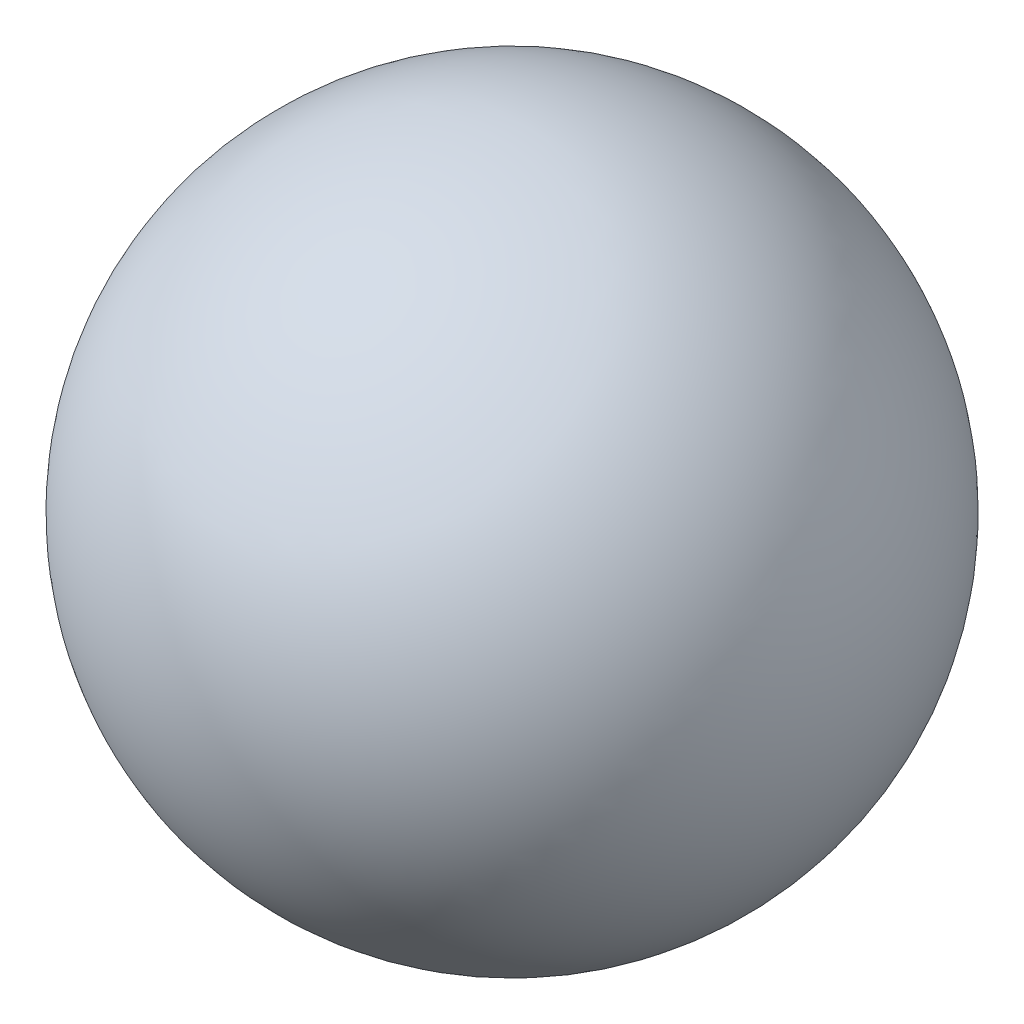
ISO-10303-21;
HEADER;
FILE_DESCRIPTION(('STEP AP214'),'2;1');
FILE_NAME('part.step','',(''),(''),'','','');
FILE_SCHEMA(('AUTOMOTIVE_DESIGN { 1 0 10303 214 1 1 1 1 }'));
ENDSEC;
DATA;
#1=APPLICATION_CONTEXT('core data for automotive mechanical design processes');
#2=APPLICATION_PROTOCOL_DEFINITION('international standard','automotive_design',2000,#1);
#3=PRODUCT_CONTEXT('',#1,'mechanical');
#4=PRODUCT('Part','Part','',(#3));
#5=PRODUCT_RELATED_PRODUCT_CATEGORY('part','',(#4));
#6=PRODUCT_DEFINITION_FORMATION('','',#4);
#7=PRODUCT_DEFINITION_CONTEXT('part definition',#1,'design');
#8=PRODUCT_DEFINITION('design','',#6,#7);
#9=PRODUCT_DEFINITION_SHAPE('','',#8);
#10=(LENGTH_UNIT() NAMED_UNIT(*) SI_UNIT(.MILLI.,.METRE.));
#11=(NAMED_UNIT(*) PLANE_ANGLE_UNIT() SI_UNIT($,.RADIAN.));
#12=(NAMED_UNIT(*) SI_UNIT($,.STERADIAN.) SOLID_ANGLE_UNIT());
#13=UNCERTAINTY_MEASURE_WITH_UNIT(LENGTH_MEASURE(1.E-05),#10,'distance_accuracy_value','');
#14=(GEOMETRIC_REPRESENTATION_CONTEXT(3) GLOBAL_UNCERTAINTY_ASSIGNED_CONTEXT((#13)) GLOBAL_UNIT_ASSIGNED_CONTEXT((#10,
#11,#12)) REPRESENTATION_CONTEXT('',''));
#15=CARTESIAN_POINT('',(0.,0.,0.));
#16=DIRECTION('',(0.,0.,1.));
#17=DIRECTION('',(1.,0.,0.));
#18=AXIS2_PLACEMENT_3D('',#15,#16,#17);
#19=CARTESIAN_POINT('',(0.,0.,-40.));
#20=DIRECTION('',(0.,0.,1.));
#21=DIRECTION('',(-1.,0.,0.));
#22=AXIS2_PLACEMENT_3D('',#19,#20,#21);
#23=SPHERICAL_SURFACE('',#22,40.);
#24=CARTESIAN_POINT('',(0.,0.,0.));
#25=VERTEX_POINT('',#24);
#26=VERTEX_LOOP('',#25);
#27=FACE_BOUND('',#26,.T.);
#28=ADVANCED_FACE('F33',(#27),#23,.T.);
#29=CLOSED_SHELL('',(#28));
#30=MANIFOLD_SOLID_BREP('B2',#29);
#31=ADVANCED_BREP_SHAPE_REPRESENTATION('',(#18,#30),#14);
#32=SHAPE_DEFINITION_REPRESENTATION(#9,#31);
ENDSEC;
END-ISO-10303-21;
